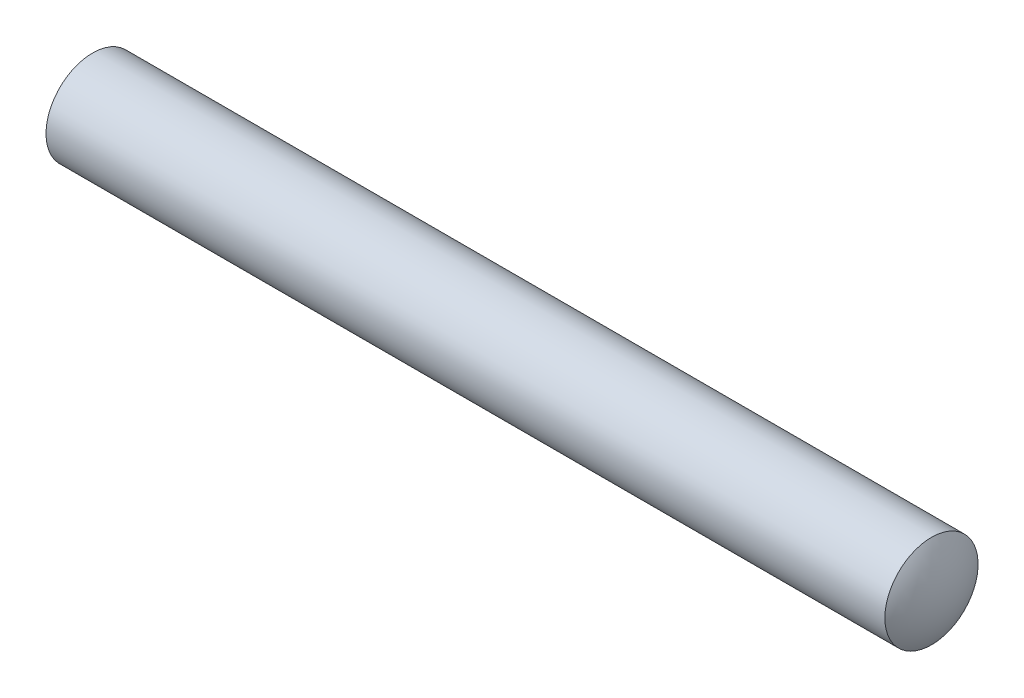
ISO-10303-21;
HEADER;
FILE_DESCRIPTION(('STEP AP214'),'2;1');
FILE_NAME('part.step','',(''),(''),'','','');
FILE_SCHEMA(('AUTOMOTIVE_DESIGN { 1 0 10303 214 1 1 1 1 }'));
ENDSEC;
DATA;
#1=APPLICATION_CONTEXT('core data for automotive mechanical design processes');
#2=APPLICATION_PROTOCOL_DEFINITION('international standard','automotive_design',2000,#1);
#3=PRODUCT_CONTEXT('',#1,'mechanical');
#4=PRODUCT('Part','Part','',(#3));
#5=PRODUCT_RELATED_PRODUCT_CATEGORY('part','',(#4));
#6=PRODUCT_DEFINITION_FORMATION('','',#4);
#7=PRODUCT_DEFINITION_CONTEXT('part definition',#1,'design');
#8=PRODUCT_DEFINITION('design','',#6,#7);
#9=PRODUCT_DEFINITION_SHAPE('','',#8);
#10=(LENGTH_UNIT() NAMED_UNIT(*) SI_UNIT(.MILLI.,.METRE.));
#11=(NAMED_UNIT(*) PLANE_ANGLE_UNIT() SI_UNIT($,.RADIAN.));
#12=(NAMED_UNIT(*) SI_UNIT($,.STERADIAN.) SOLID_ANGLE_UNIT());
#13=UNCERTAINTY_MEASURE_WITH_UNIT(LENGTH_MEASURE(1.E-05),#10,'distance_accuracy_value','');
#14=(GEOMETRIC_REPRESENTATION_CONTEXT(3) GLOBAL_UNCERTAINTY_ASSIGNED_CONTEXT((#13)) GLOBAL_UNIT_ASSIGNED_CONTEXT((#10,
#11,#12)) REPRESENTATION_CONTEXT('',''));
#15=CARTESIAN_POINT('',(0.,0.,0.));
#16=DIRECTION('',(0.,0.,1.));
#17=DIRECTION('',(1.,0.,0.));
#18=AXIS2_PLACEMENT_3D('',#15,#16,#17);
#19=CARTESIAN_POINT('',(-14.9666666666667,0.,0.));
#20=DIRECTION('',(0.,1.,0.));
#21=DIRECTION('',(1.,0.,0.));
#22=AXIS2_PLACEMENT_3D('',#19,#20,#21);
#23=SPHERICAL_SURFACE('',#22,3.63333333333334);
#24=CARTESIAN_POINT('',(-18.,0.,0.));
#25=DIRECTION('',(-1.,0.,0.));
#26=DIRECTION('',(0.,0.,1.));
#27=AXIS2_PLACEMENT_3D('',#24,#25,#26);
#28=CIRCLE('',#27,2.);
#29=CARTESIAN_POINT('',(-18.,0.,2.));
#30=VERTEX_POINT('',#29);
#31=EDGE_CURVE('E12',#30,#30,#28,.F.);
#32=ORIENTED_EDGE('',*,*,#31,.F.);
#33=EDGE_LOOP('',(#32));
#34=FACE_BOUND('',#33,.T.);
#35=ADVANCED_FACE('F23',(#34),#23,.T.);
#36=CARTESIAN_POINT('',(14.9666666666667,0.,0.));
#37=DIRECTION('',(0.,1.,0.));
#38=DIRECTION('',(1.,0.,0.));
#39=AXIS2_PLACEMENT_3D('',#36,#37,#38);
#40=SPHERICAL_SURFACE('',#39,3.63333333333334);
#41=CARTESIAN_POINT('',(18.,0.,0.));
#42=DIRECTION('',(-1.,0.,0.));
#43=DIRECTION('',(0.,0.,1.));
#44=AXIS2_PLACEMENT_3D('',#41,#42,#43);
#45=CIRCLE('',#44,2.);
#46=CARTESIAN_POINT('',(18.,0.,2.));
#47=VERTEX_POINT('',#46);
#48=EDGE_CURVE('E27',#47,#47,#45,.T.);
#49=ORIENTED_EDGE('',*,*,#48,.F.);
#50=EDGE_LOOP('',(#49));
#51=FACE_BOUND('',#50,.T.);
#52=ADVANCED_FACE('F38',(#51),#40,.T.);
#53=CARTESIAN_POINT('',(-4.78185842773571,0.,0.));
#54=DIRECTION('',(-1.,0.,0.));
#55=DIRECTION('',(0.,0.,1.));
#56=AXIS2_PLACEMENT_3D('',#53,#54,#55);
#57=CYLINDRICAL_SURFACE('',#56,2.);
#58=ORIENTED_EDGE('',*,*,#31,.T.);
#59=EDGE_LOOP('',(#58));
#60=FACE_BOUND('',#59,.T.);
#61=ORIENTED_EDGE('',*,*,#48,.T.);
#62=EDGE_LOOP('',(#61));
#63=FACE_BOUND('',#62,.T.);
#64=ADVANCED_FACE('F41',(#60,#63),#57,.T.);
#65=CLOSED_SHELL('',(#35,#52,#64));
#66=MANIFOLD_SOLID_BREP('B1',#65);
#67=ADVANCED_BREP_SHAPE_REPRESENTATION('',(#18,#66),#14);
#68=SHAPE_DEFINITION_REPRESENTATION(#9,#67);
ENDSEC;
END-ISO-10303-21;
